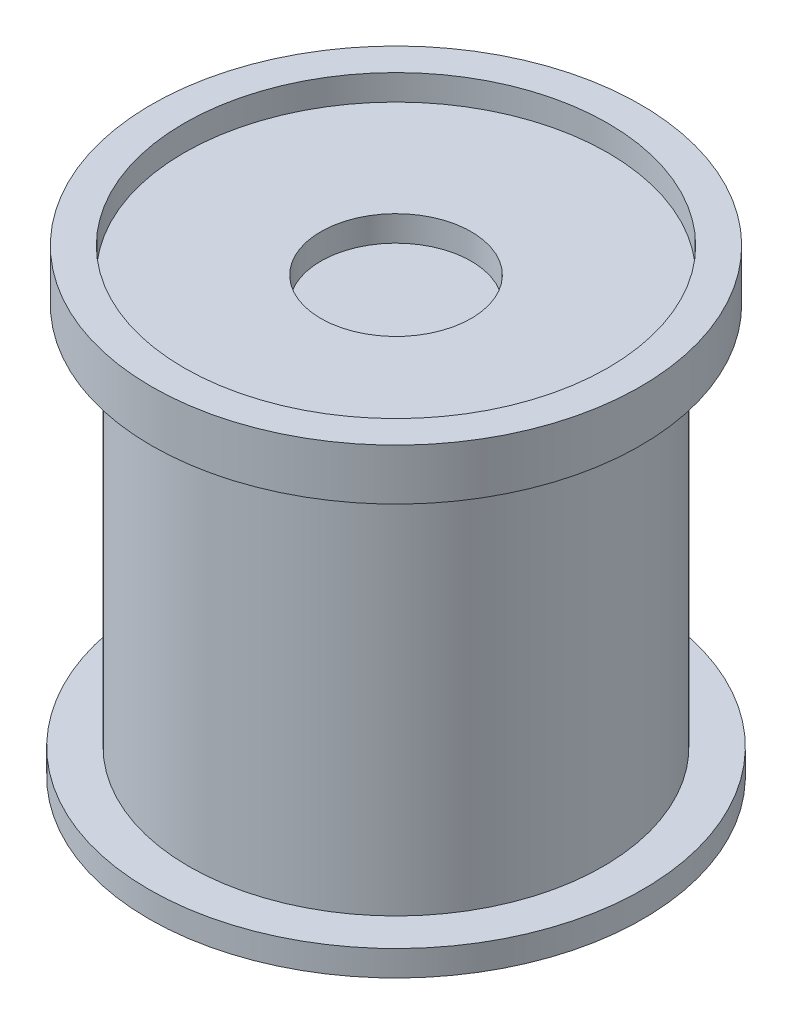
ISO-10303-21;
HEADER;
FILE_DESCRIPTION(('STEP AP214'),'2;1');
FILE_NAME('part.step','',(''),(''),'','','');
FILE_SCHEMA(('AUTOMOTIVE_DESIGN { 1 0 10303 214 1 1 1 1 }'));
ENDSEC;
DATA;
#1=APPLICATION_CONTEXT('core data for automotive mechanical design processes');
#2=APPLICATION_PROTOCOL_DEFINITION('international standard','automotive_design',2000,#1);
#3=PRODUCT_CONTEXT('',#1,'mechanical');
#4=PRODUCT('Part','Part','',(#3));
#5=PRODUCT_RELATED_PRODUCT_CATEGORY('part','',(#4));
#6=PRODUCT_DEFINITION_FORMATION('','',#4);
#7=PRODUCT_DEFINITION_CONTEXT('part definition',#1,'design');
#8=PRODUCT_DEFINITION('design','',#6,#7);
#9=PRODUCT_DEFINITION_SHAPE('','',#8);
#10=(LENGTH_UNIT() NAMED_UNIT(*) SI_UNIT(.MILLI.,.METRE.));
#11=(NAMED_UNIT(*) PLANE_ANGLE_UNIT() SI_UNIT($,.RADIAN.));
#12=(NAMED_UNIT(*) SI_UNIT($,.STERADIAN.) SOLID_ANGLE_UNIT());
#13=UNCERTAINTY_MEASURE_WITH_UNIT(LENGTH_MEASURE(1.E-05),#10,'distance_accuracy_value','');
#14=(GEOMETRIC_REPRESENTATION_CONTEXT(3) GLOBAL_UNCERTAINTY_ASSIGNED_CONTEXT((#13)) GLOBAL_UNIT_ASSIGNED_CONTEXT((#10,
#11,#12)) REPRESENTATION_CONTEXT('',''));
#15=CARTESIAN_POINT('',(0.,0.,0.));
#16=DIRECTION('',(0.,0.,1.));
#17=DIRECTION('',(1.,0.,0.));
#18=AXIS2_PLACEMENT_3D('',#15,#16,#17);
#19=CARTESIAN_POINT('',(0.,1.,0.));
#20=DIRECTION('',(0.,-1.,0.));
#21=DIRECTION('',(0.,0.,-1.));
#22=AXIS2_PLACEMENT_3D('',#19,#20,#21);
#23=CYLINDRICAL_SURFACE('',#22,9.67330263978435);
#24=CARTESIAN_POINT('',(0.,1.,0.));
#25=DIRECTION('',(0.,1.,0.));
#26=DIRECTION('',(0.,0.,1.));
#27=AXIS2_PLACEMENT_3D('',#24,#25,#26);
#28=CIRCLE('',#27,9.67330263978435);
#29=CARTESIAN_POINT('',(0.,1.,9.67330263978435));
#30=VERTEX_POINT('',#29);
#31=EDGE_CURVE('E40',#30,#30,#28,.T.);
#32=ORIENTED_EDGE('',*,*,#31,.F.);
#33=EDGE_LOOP('',(#32));
#34=FACE_BOUND('',#33,.T.);
#35=CARTESIAN_POINT('',(0.,0.,0.));
#36=DIRECTION('',(0.,1.,0.));
#37=DIRECTION('',(0.,0.,1.));
#38=AXIS2_PLACEMENT_3D('',#35,#36,#37);
#39=CIRCLE('',#38,9.67330263978435);
#40=CARTESIAN_POINT('',(0.,0.,9.67330263978435));
#41=VERTEX_POINT('',#40);
#42=EDGE_CURVE('E36',#41,#41,#39,.T.);
#43=ORIENTED_EDGE('',*,*,#42,.T.);
#44=EDGE_LOOP('',(#43));
#45=FACE_BOUND('',#44,.T.);
#46=ADVANCED_FACE('F33',(#34,#45),#23,.T.);
#47=CARTESIAN_POINT('',(0.,1.,0.));
#48=DIRECTION('',(0.,1.,0.));
#49=DIRECTION('',(0.,0.,1.));
#50=AXIS2_PLACEMENT_3D('',#47,#48,#49);
#51=PLANE('',#50);
#52=CARTESIAN_POINT('',(0.,1.,0.));
#53=DIRECTION('',(0.,1.,0.));
#54=DIRECTION('',(0.,0.,1.));
#55=AXIS2_PLACEMENT_3D('',#52,#53,#54);
#56=CIRCLE('',#55,8.11260627796009);
#57=CARTESIAN_POINT('',(0.,1.,8.11260627796009));
#58=VERTEX_POINT('',#57);
#59=EDGE_CURVE('E10',#58,#58,#56,.T.);
#60=ORIENTED_EDGE('',*,*,#59,.F.);
#61=EDGE_LOOP('',(#60));
#62=FACE_BOUND('',#61,.T.);
#63=ORIENTED_EDGE('',*,*,#31,.T.);
#64=EDGE_LOOP('',(#63));
#65=FACE_BOUND('',#64,.T.);
#66=ADVANCED_FACE('F108',(#62,#65),#51,.T.);
#67=CARTESIAN_POINT('',(0.,0.,0.));
#68=DIRECTION('',(0.,1.,0.));
#69=DIRECTION('',(0.,0.,1.));
#70=AXIS2_PLACEMENT_3D('',#67,#68,#69);
#71=PLANE('',#70);
#72=ORIENTED_EDGE('',*,*,#42,.F.);
#73=EDGE_LOOP('',(#72));
#74=FACE_BOUND('',#73,.T.);
#75=ADVANCED_FACE('F113',(#74),#71,.F.);
#76=CARTESIAN_POINT('',(0.,16.,0.));
#77=DIRECTION('',(0.,-1.,0.));
#78=DIRECTION('',(0.,0.,-1.));
#79=AXIS2_PLACEMENT_3D('',#76,#77,#78);
#80=CYLINDRICAL_SURFACE('',#79,8.11260627796009);
#81=CARTESIAN_POINT('',(0.,16.,0.));
#82=DIRECTION('',(0.,1.,0.));
#83=DIRECTION('',(0.,0.,1.));
#84=AXIS2_PLACEMENT_3D('',#81,#82,#83);
#85=CIRCLE('',#84,8.11260627796009);
#86=CARTESIAN_POINT('',(0.,16.,8.11260627796009));
#87=VERTEX_POINT('',#86);
#88=EDGE_CURVE('E46',#87,#87,#85,.T.);
#89=ORIENTED_EDGE('',*,*,#88,.F.);
#90=EDGE_LOOP('',(#89));
#91=FACE_BOUND('',#90,.T.);
#92=ORIENTED_EDGE('',*,*,#59,.T.);
#93=EDGE_LOOP('',(#92));
#94=FACE_BOUND('',#93,.T.);
#95=ADVANCED_FACE('F98',(#91,#94),#80,.T.);
#96=CARTESIAN_POINT('',(0.,18.,0.));
#97=DIRECTION('',(0.,-1.,0.));
#98=DIRECTION('',(0.,0.,-1.));
#99=AXIS2_PLACEMENT_3D('',#96,#97,#98);
#100=CYLINDRICAL_SURFACE('',#99,9.57211411549786);
#101=CARTESIAN_POINT('',(0.,18.,0.));
#102=DIRECTION('',(0.,1.,0.));
#103=DIRECTION('',(0.,0.,1.));
#104=AXIS2_PLACEMENT_3D('',#101,#102,#103);
#105=CIRCLE('',#104,9.57211411549786);
#106=CARTESIAN_POINT('',(0.,18.,9.57211411549786));
#107=VERTEX_POINT('',#106);
#108=EDGE_CURVE('E49',#107,#107,#105,.T.);
#109=ORIENTED_EDGE('',*,*,#108,.F.);
#110=EDGE_LOOP('',(#109));
#111=FACE_BOUND('',#110,.T.);
#112=CARTESIAN_POINT('',(0.,16.,0.));
#113=DIRECTION('',(0.,1.,0.));
#114=DIRECTION('',(0.,0.,1.));
#115=AXIS2_PLACEMENT_3D('',#112,#113,#114);
#116=CIRCLE('',#115,9.57211411549786);
#117=CARTESIAN_POINT('',(0.,16.,9.57211411549786));
#118=VERTEX_POINT('',#117);
#119=EDGE_CURVE('E50',#118,#118,#116,.T.);
#120=ORIENTED_EDGE('',*,*,#119,.T.);
#121=EDGE_LOOP('',(#120));
#122=FACE_BOUND('',#121,.T.);
#123=ADVANCED_FACE('F92',(#111,#122),#100,.T.);
#124=CARTESIAN_POINT('',(0.,18.,0.));
#125=DIRECTION('',(0.,1.,0.));
#126=DIRECTION('',(0.,0.,1.));
#127=AXIS2_PLACEMENT_3D('',#124,#125,#126);
#128=PLANE('',#127);
#129=CARTESIAN_POINT('',(0.,18.,0.));
#130=DIRECTION('',(0.,1.,0.));
#131=DIRECTION('',(0.,0.,1.));
#132=AXIS2_PLACEMENT_3D('',#129,#130,#131);
#133=CIRCLE('',#132,8.29812411200495);
#134=CARTESIAN_POINT('',(0.,18.,8.29812411200495));
#135=VERTEX_POINT('',#134);
#136=EDGE_CURVE('E56',#135,#135,#133,.T.);
#137=ORIENTED_EDGE('',*,*,#136,.F.);
#138=EDGE_LOOP('',(#137));
#139=FACE_BOUND('',#138,.T.);
#140=ORIENTED_EDGE('',*,*,#108,.T.);
#141=EDGE_LOOP('',(#140));
#142=FACE_BOUND('',#141,.T.);
#143=ADVANCED_FACE('F89',(#139,#142),#128,.T.);
#144=CARTESIAN_POINT('',(0.,16.,0.));
#145=DIRECTION('',(0.,1.,0.));
#146=DIRECTION('',(0.,0.,1.));
#147=AXIS2_PLACEMENT_3D('',#144,#145,#146);
#148=PLANE('',#147);
#149=ORIENTED_EDGE('',*,*,#88,.T.);
#150=EDGE_LOOP('',(#149));
#151=FACE_BOUND('',#150,.T.);
#152=ORIENTED_EDGE('',*,*,#119,.F.);
#153=EDGE_LOOP('',(#152));
#154=FACE_BOUND('',#153,.T.);
#155=ADVANCED_FACE('F85',(#151,#154),#148,.F.);
#156=CARTESIAN_POINT('',(0.,17.,0.));
#157=DIRECTION('',(0.,1.,0.));
#158=DIRECTION('',(0.,0.,1.));
#159=AXIS2_PLACEMENT_3D('',#156,#157,#158);
#160=CYLINDRICAL_SURFACE('',#159,8.29812411200495);
#161=CARTESIAN_POINT('',(0.,17.,0.));
#162=DIRECTION('',(0.,1.,0.));
#163=DIRECTION('',(0.,0.,1.));
#164=AXIS2_PLACEMENT_3D('',#161,#162,#163);
#165=CIRCLE('',#164,8.29812411200495);
#166=CARTESIAN_POINT('',(0.,17.,8.29812411200495));
#167=VERTEX_POINT('',#166);
#168=EDGE_CURVE('E53',#167,#167,#165,.T.);
#169=ORIENTED_EDGE('',*,*,#168,.F.);
#170=EDGE_LOOP('',(#169));
#171=FACE_BOUND('',#170,.T.);
#172=ORIENTED_EDGE('',*,*,#136,.T.);
#173=EDGE_LOOP('',(#172));
#174=FACE_BOUND('',#173,.T.);
#175=ADVANCED_FACE('F79',(#171,#174),#160,.F.);
#176=CARTESIAN_POINT('',(0.,17.,0.));
#177=DIRECTION('',(0.,1.,0.));
#178=DIRECTION('',(0.,0.,1.));
#179=AXIS2_PLACEMENT_3D('',#176,#177,#178);
#180=PLANE('',#179);
#181=CARTESIAN_POINT('',(0.,17.,0.));
#182=DIRECTION('',(0.,1.,0.));
#183=DIRECTION('',(0.,0.,1.));
#184=AXIS2_PLACEMENT_3D('',#181,#182,#183);
#185=CIRCLE('',#184,2.94555235470041);
#186=CARTESIAN_POINT('',(0.,17.,2.94555235470041));
#187=VERTEX_POINT('',#186);
#188=EDGE_CURVE('E62',#187,#187,#185,.T.);
#189=ORIENTED_EDGE('',*,*,#188,.F.);
#190=EDGE_LOOP('',(#189));
#191=FACE_BOUND('',#190,.T.);
#192=ORIENTED_EDGE('',*,*,#168,.T.);
#193=EDGE_LOOP('',(#192));
#194=FACE_BOUND('',#193,.T.);
#195=ADVANCED_FACE('F73',(#191,#194),#180,.T.);
#196=CARTESIAN_POINT('',(0.,16.,0.));
#197=DIRECTION('',(0.,1.,0.));
#198=DIRECTION('',(0.,0.,1.));
#199=AXIS2_PLACEMENT_3D('',#196,#197,#198);
#200=CYLINDRICAL_SURFACE('',#199,2.94555235470041);
#201=CARTESIAN_POINT('',(0.,16.,0.));
#202=DIRECTION('',(0.,1.,0.));
#203=DIRECTION('',(0.,0.,1.));
#204=AXIS2_PLACEMENT_3D('',#201,#202,#203);
#205=CIRCLE('',#204,2.94555235470041);
#206=CARTESIAN_POINT('',(0.,16.,2.94555235470041));
#207=VERTEX_POINT('',#206);
#208=EDGE_CURVE('E59',#207,#207,#205,.T.);
#209=ORIENTED_EDGE('',*,*,#208,.F.);
#210=EDGE_LOOP('',(#209));
#211=FACE_BOUND('',#210,.T.);
#212=ORIENTED_EDGE('',*,*,#188,.T.);
#213=EDGE_LOOP('',(#212));
#214=FACE_BOUND('',#213,.T.);
#215=ADVANCED_FACE('F70',(#211,#214),#200,.F.);
#216=CARTESIAN_POINT('',(0.,16.,0.));
#217=DIRECTION('',(0.,1.,0.));
#218=DIRECTION('',(0.,0.,1.));
#219=AXIS2_PLACEMENT_3D('',#216,#217,#218);
#220=PLANE('',#219);
#221=ORIENTED_EDGE('',*,*,#208,.T.);
#222=EDGE_LOOP('',(#221));
#223=FACE_BOUND('',#222,.T.);
#224=ADVANCED_FACE('F68',(#223),#220,.T.);
#225=CLOSED_SHELL('',(#46,#66,#75,#95,#123,#143,#155,#175,#195,#215,#224));
#226=MANIFOLD_SOLID_BREP('B2',#225);
#227=ADVANCED_BREP_SHAPE_REPRESENTATION('',(#18,#226),#14);
#228=SHAPE_DEFINITION_REPRESENTATION(#9,#227);
ENDSEC;
END-ISO-10303-21;
